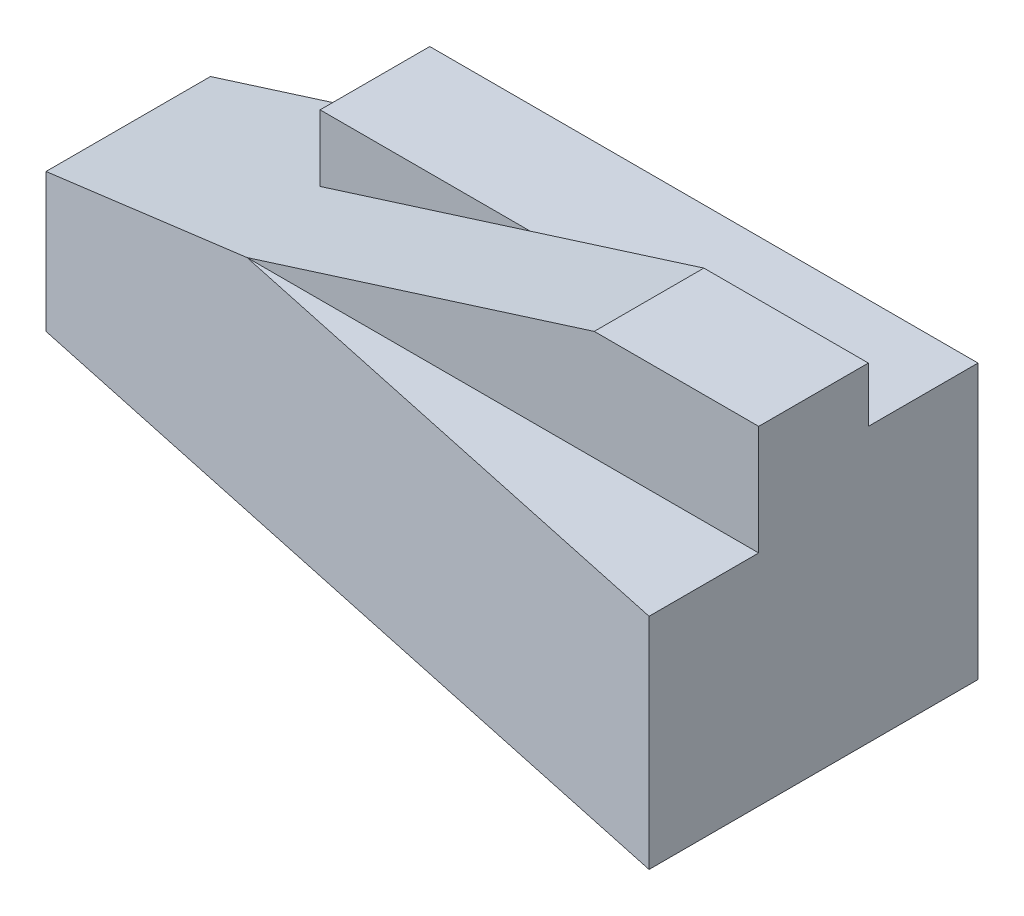
ISO-10303-21;
HEADER;
FILE_DESCRIPTION(('STEP AP214'),'2;1');
FILE_NAME('part.step','',(''),(''),'','','');
FILE_SCHEMA(('AUTOMOTIVE_DESIGN { 1 0 10303 214 1 1 1 1 }'));
ENDSEC;
DATA;
#1=APPLICATION_CONTEXT('core data for automotive mechanical design processes');
#2=APPLICATION_PROTOCOL_DEFINITION('international standard','automotive_design',2000,#1);
#3=PRODUCT_CONTEXT('',#1,'mechanical');
#4=PRODUCT('Part','Part','',(#3));
#5=PRODUCT_RELATED_PRODUCT_CATEGORY('part','',(#4));
#6=PRODUCT_DEFINITION_FORMATION('','',#4);
#7=PRODUCT_DEFINITION_CONTEXT('part definition',#1,'design');
#8=PRODUCT_DEFINITION('design','',#6,#7);
#9=PRODUCT_DEFINITION_SHAPE('','',#8);
#10=(LENGTH_UNIT() NAMED_UNIT(*) SI_UNIT(.MILLI.,.METRE.));
#11=(NAMED_UNIT(*) PLANE_ANGLE_UNIT() SI_UNIT($,.RADIAN.));
#12=(NAMED_UNIT(*) SI_UNIT($,.STERADIAN.) SOLID_ANGLE_UNIT());
#13=UNCERTAINTY_MEASURE_WITH_UNIT(LENGTH_MEASURE(1.E-05),#10,'distance_accuracy_value','');
#14=(GEOMETRIC_REPRESENTATION_CONTEXT(3) GLOBAL_UNCERTAINTY_ASSIGNED_CONTEXT((#13)) GLOBAL_UNIT_ASSIGNED_CONTEXT((#10,
#11,#12)) REPRESENTATION_CONTEXT('',''));
#15=CARTESIAN_POINT('',(0.,0.,0.));
#16=DIRECTION('',(0.,0.,1.));
#17=DIRECTION('',(1.,0.,0.));
#18=AXIS2_PLACEMENT_3D('',#15,#16,#17);
#19=CARTESIAN_POINT('',(70.,20.,0.));
#20=DIRECTION('',(0.,0.,1.));
#21=DIRECTION('',(1.,0.,0.));
#22=AXIS2_PLACEMENT_3D('',#19,#20,#21);
#23=PLANE('',#22);
#24=DIRECTION('',(-0.953582665134141,-0.3011313679371,0.));
#25=VECTOR('',#24,1.);
#26=CARTESIAN_POINT('',(20.3022670025189,19.0428211586901,0.));
#27=LINE('',#26,#25);
#28=CARTESIAN_POINT('',(20.,18.9473684210525,0.));
#29=VERTEX_POINT('',#28);
#30=CARTESIAN_POINT('',(0.,12.6315789473683,0.));
#31=VERTEX_POINT('',#30);
#32=EDGE_CURVE('E129',#29,#31,#27,.T.);
#33=ORIENTED_EDGE('',*,*,#32,.F.);
#34=DIRECTION('',(0.,-1.,0.));
#35=VECTOR('',#34,1.);
#36=CARTESIAN_POINT('',(20.,25.,0.));
#37=LINE('',#36,#35);
#38=CARTESIAN_POINT('',(20.,25.,0.));
#39=VERTEX_POINT('',#38);
#40=EDGE_CURVE('E63',#39,#29,#37,.T.);
#41=ORIENTED_EDGE('',*,*,#40,.F.);
#42=DIRECTION('',(-1.,0.,0.));
#43=VECTOR('',#42,1.);
#44=CARTESIAN_POINT('',(20.,25.,0.));
#45=LINE('',#44,#43);
#46=CARTESIAN_POINT('',(70.,25.,0.));
#47=VERTEX_POINT('',#46);
#48=EDGE_CURVE('E188',#47,#39,#45,.T.);
#49=ORIENTED_EDGE('',*,*,#48,.F.);
#50=DIRECTION('',(0.,-1.,0.));
#51=VECTOR('',#50,1.);
#52=CARTESIAN_POINT('',(70.,20.,0.));
#53=LINE('',#52,#51);
#54=CARTESIAN_POINT('',(70.,0.,0.));
#55=VERTEX_POINT('',#54);
#56=EDGE_CURVE('E154',#47,#55,#53,.T.);
#57=ORIENTED_EDGE('',*,*,#56,.T.);
#58=DIRECTION('',(-1.,0.,0.));
#59=VECTOR('',#58,1.);
#60=CARTESIAN_POINT('',(70.,0.,0.));
#61=LINE('',#60,#59);
#62=CARTESIAN_POINT('',(0.,0.,0.));
#63=VERTEX_POINT('',#62);
#64=EDGE_CURVE('E162',#55,#63,#61,.T.);
#65=ORIENTED_EDGE('',*,*,#64,.T.);
#66=DIRECTION('',(0.,-1.,0.));
#67=VECTOR('',#66,1.);
#68=CARTESIAN_POINT('',(0.,20.,0.));
#69=LINE('',#68,#67);
#70=EDGE_CURVE('E11',#31,#63,#69,.T.);
#71=ORIENTED_EDGE('',*,*,#70,.F.);
#72=EDGE_LOOP('',(#33,#41,#49,#57,#65,#71));
#73=FACE_BOUND('',#72,.T.);
#74=ADVANCED_FACE('F41',(#73),#23,.F.);
#75=CARTESIAN_POINT('',(0.,20.,0.));
#76=DIRECTION('',(1.,0.,0.));
#77=DIRECTION('',(0.,0.,-1.));
#78=AXIS2_PLACEMENT_3D('',#75,#76,#77);
#79=PLANE('',#78);
#80=DIRECTION('',(0.,0.,1.));
#81=VECTOR('',#80,1.);
#82=CARTESIAN_POINT('',(0.,12.6315789473683,0.));
#83=LINE('',#82,#81);
#84=CARTESIAN_POINT('',(0.,12.6315789473683,15.));
#85=VERTEX_POINT('',#84);
#86=EDGE_CURVE('E125',#31,#85,#83,.T.);
#87=ORIENTED_EDGE('',*,*,#86,.F.);
#88=ORIENTED_EDGE('',*,*,#70,.T.);
#89=DIRECTION('',(0.,0.,1.));
#90=VECTOR('',#89,1.);
#91=CARTESIAN_POINT('',(0.,0.,0.));
#92=LINE('',#91,#90);
#93=CARTESIAN_POINT('',(0.,0.,15.));
#94=VERTEX_POINT('',#93);
#95=EDGE_CURVE('E165',#63,#94,#92,.T.);
#96=ORIENTED_EDGE('',*,*,#95,.T.);
#97=DIRECTION('',(0.,-1.,0.));
#98=VECTOR('',#97,1.);
#99=CARTESIAN_POINT('',(0.,20.,15.));
#100=LINE('',#99,#98);
#101=EDGE_CURVE('E48',#85,#94,#100,.T.);
#102=ORIENTED_EDGE('',*,*,#101,.F.);
#103=EDGE_LOOP('',(#87,#88,#96,#102));
#104=FACE_BOUND('',#103,.T.);
#105=ADVANCED_FACE('F174',(#104),#79,.F.);
#106=CARTESIAN_POINT('',(0.,20.,15.));
#107=DIRECTION('',(0.209529088730873,0.,-0.97780241407741));
#108=DIRECTION('',(-0.97780241407741,0.,-0.209529088730873));
#109=AXIS2_PLACEMENT_3D('',#106,#107,#108);
#110=PLANE('',#109);
#111=DIRECTION('',(0.93427700121924,0.295034842490289,0.20020221454698));
#112=VECTOR('',#111,1.);
#113=CARTESIAN_POINT('',(2.03106302660965,13.2729672715608,15.4352277914164));
#114=LINE('',#113,#112);
#115=CARTESIAN_POINT('',(23.3333333333336,20.,20.));
#116=VERTEX_POINT('',#115);
#117=EDGE_CURVE('E117',#85,#116,#114,.T.);
#118=ORIENTED_EDGE('',*,*,#117,.F.);
#119=ORIENTED_EDGE('',*,*,#101,.T.);
#120=DIRECTION('',(0.97780241407741,0.,0.209529088730873));
#121=VECTOR('',#120,1.);
#122=CARTESIAN_POINT('',(0.,0.,15.));
#123=LINE('',#122,#121);
#124=CARTESIAN_POINT('',(70.,0.,30.));
#125=VERTEX_POINT('',#124);
#126=EDGE_CURVE('E156',#94,#125,#123,.T.);
#127=ORIENTED_EDGE('',*,*,#126,.T.);
#128=DIRECTION('',(0.,-1.,0.));
#129=VECTOR('',#128,1.);
#130=CARTESIAN_POINT('',(70.,20.,30.));
#131=LINE('',#130,#129);
#132=CARTESIAN_POINT('',(70.,20.,30.));
#133=VERTEX_POINT('',#132);
#134=EDGE_CURVE('E151',#133,#125,#131,.T.);
#135=ORIENTED_EDGE('',*,*,#134,.F.);
#136=DIRECTION('',(0.97780241407741,0.,0.209529088730873));
#137=VECTOR('',#136,1.);
#138=CARTESIAN_POINT('',(0.,20.,15.));
#139=LINE('',#138,#137);
#140=EDGE_CURVE('E135',#116,#133,#139,.T.);
#141=ORIENTED_EDGE('',*,*,#140,.F.);
#142=EDGE_LOOP('',(#118,#119,#127,#135,#141));
#143=FACE_BOUND('',#142,.T.);
#144=ADVANCED_FACE('F149',(#143),#110,.F.);
#145=CARTESIAN_POINT('',(70.,25.,10.));
#146=DIRECTION('',(0.,0.,-1.));
#147=DIRECTION('',(-1.,0.,0.));
#148=AXIS2_PLACEMENT_3D('',#145,#146,#147);
#149=PLANE('',#148);
#150=DIRECTION('',(0.,-1.,0.));
#151=VECTOR('',#150,1.);
#152=CARTESIAN_POINT('',(20.,25.,10.));
#153=LINE('',#152,#151);
#154=CARTESIAN_POINT('',(20.,25.,10.));
#155=VERTEX_POINT('',#154);
#156=CARTESIAN_POINT('',(20.,18.9473684210525,10.));
#157=VERTEX_POINT('',#156);
#158=EDGE_CURVE('E55',#155,#157,#153,.T.);
#159=ORIENTED_EDGE('',*,*,#158,.T.);
#160=DIRECTION('',(0.953582665134141,0.3011313679371,0.));
#161=VECTOR('',#160,1.);
#162=CARTESIAN_POINT('',(23.3333333333336,20.,10.));
#163=LINE('',#162,#161);
#164=CARTESIAN_POINT('',(39.1666666666668,25.,10.));
#165=VERTEX_POINT('',#164);
#166=EDGE_CURVE('E191',#157,#165,#163,.T.);
#167=ORIENTED_EDGE('',*,*,#166,.T.);
#168=DIRECTION('',(1.,0.,0.));
#169=VECTOR('',#168,1.);
#170=CARTESIAN_POINT('',(70.,25.,10.));
#171=LINE('',#170,#169);
#172=EDGE_CURVE('E197',#155,#165,#171,.T.);
#173=ORIENTED_EDGE('',*,*,#172,.F.);
#174=EDGE_LOOP('',(#159,#167,#173));
#175=FACE_BOUND('',#174,.T.);
#176=ADVANCED_FACE('F220',(#175),#149,.F.);
#177=CARTESIAN_POINT('',(0.,20.,0.));
#178=DIRECTION('',(0.,1.,0.));
#179=DIRECTION('',(0.,0.,1.));
#180=AXIS2_PLACEMENT_3D('',#177,#178,#179);
#181=PLANE('',#180);
#182=DIRECTION('',(1.,0.,0.));
#183=VECTOR('',#182,1.);
#184=CARTESIAN_POINT('',(70.,20.,20.));
#185=LINE('',#184,#183);
#186=CARTESIAN_POINT('',(70.,20.,20.));
#187=VERTEX_POINT('',#186);
#188=EDGE_CURVE('E133',#116,#187,#185,.T.);
#189=ORIENTED_EDGE('',*,*,#188,.F.);
#190=ORIENTED_EDGE('',*,*,#140,.T.);
#191=DIRECTION('',(0.,0.,-1.));
#192=VECTOR('',#191,1.);
#193=CARTESIAN_POINT('',(70.,20.,30.));
#194=LINE('',#193,#192);
#195=EDGE_CURVE('E138',#133,#187,#194,.T.);
#196=ORIENTED_EDGE('',*,*,#195,.T.);
#197=EDGE_LOOP('',(#189,#190,#196));
#198=FACE_BOUND('',#197,.T.);
#199=ADVANCED_FACE('F134',(#198),#181,.T.);
#200=CARTESIAN_POINT('',(55.,30.,10.));
#201=DIRECTION('',(0.,0.,1.));
#202=DIRECTION('',(1.,0.,0.));
#203=AXIS2_PLACEMENT_3D('',#200,#201,#202);
#204=PLANE('',#203);
#205=CARTESIAN_POINT('',(70.,25.,10.));
#206=VERTEX_POINT('',#205);
#207=EDGE_CURVE('E193',#165,#206,#171,.T.);
#208=ORIENTED_EDGE('',*,*,#207,.F.);
#209=CARTESIAN_POINT('',(55.,30.,9.99999999999999));
#210=VERTEX_POINT('',#209);
#211=EDGE_CURVE('E147',#165,#210,#163,.T.);
#212=ORIENTED_EDGE('',*,*,#211,.T.);
#213=DIRECTION('',(-1.,0.,0.));
#214=VECTOR('',#213,1.);
#215=CARTESIAN_POINT('',(55.,30.,10.));
#216=LINE('',#215,#214);
#217=CARTESIAN_POINT('',(70.,30.,10.));
#218=VERTEX_POINT('',#217);
#219=EDGE_CURVE('E206',#218,#210,#216,.T.);
#220=ORIENTED_EDGE('',*,*,#219,.F.);
#221=DIRECTION('',(0.,-1.,0.));
#222=VECTOR('',#221,1.);
#223=CARTESIAN_POINT('',(70.,30.,10.));
#224=LINE('',#223,#222);
#225=EDGE_CURVE('E159',#218,#206,#224,.T.);
#226=ORIENTED_EDGE('',*,*,#225,.T.);
#227=EDGE_LOOP('',(#208,#212,#220,#226));
#228=FACE_BOUND('',#227,.T.);
#229=ADVANCED_FACE('F217',(#228),#204,.F.);
#230=CARTESIAN_POINT('',(70.,20.,30.));
#231=DIRECTION('',(-1.,0.,0.));
#232=DIRECTION('',(0.,0.,1.));
#233=AXIS2_PLACEMENT_3D('',#230,#231,#232);
#234=PLANE('',#233);
#235=ORIENTED_EDGE('',*,*,#56,.F.);
#236=DIRECTION('',(0.,0.,-1.));
#237=VECTOR('',#236,1.);
#238=CARTESIAN_POINT('',(70.,25.,0.));
#239=LINE('',#238,#237);
#240=EDGE_CURVE('E200',#206,#47,#239,.T.);
#241=ORIENTED_EDGE('',*,*,#240,.F.);
#242=ORIENTED_EDGE('',*,*,#225,.F.);
#243=DIRECTION('',(0.,0.,-1.));
#244=VECTOR('',#243,1.);
#245=CARTESIAN_POINT('',(70.,30.,10.));
#246=LINE('',#245,#244);
#247=CARTESIAN_POINT('',(70.,30.,20.));
#248=VERTEX_POINT('',#247);
#249=EDGE_CURVE('E142',#248,#218,#246,.T.);
#250=ORIENTED_EDGE('',*,*,#249,.F.);
#251=DIRECTION('',(0.,-1.,0.));
#252=VECTOR('',#251,1.);
#253=CARTESIAN_POINT('',(70.,30.,20.));
#254=LINE('',#253,#252);
#255=EDGE_CURVE('E211',#248,#187,#254,.T.);
#256=ORIENTED_EDGE('',*,*,#255,.T.);
#257=ORIENTED_EDGE('',*,*,#195,.F.);
#258=ORIENTED_EDGE('',*,*,#134,.T.);
#259=DIRECTION('',(0.,0.,-1.));
#260=VECTOR('',#259,1.);
#261=CARTESIAN_POINT('',(70.,0.,30.));
#262=LINE('',#261,#260);
#263=EDGE_CURVE('E152',#125,#55,#262,.T.);
#264=ORIENTED_EDGE('',*,*,#263,.T.);
#265=EDGE_LOOP('',(#235,#241,#242,#250,#256,#257,#258,#264));
#266=FACE_BOUND('',#265,.T.);
#267=ADVANCED_FACE('F181',(#266),#234,.F.);
#268=CARTESIAN_POINT('',(0.,0.,0.));
#269=DIRECTION('',(0.,1.,0.));
#270=DIRECTION('',(0.,0.,1.));
#271=AXIS2_PLACEMENT_3D('',#268,#269,#270);
#272=PLANE('',#271);
#273=ORIENTED_EDGE('',*,*,#64,.F.);
#274=ORIENTED_EDGE('',*,*,#263,.F.);
#275=ORIENTED_EDGE('',*,*,#126,.F.);
#276=ORIENTED_EDGE('',*,*,#95,.F.);
#277=EDGE_LOOP('',(#273,#274,#275,#276));
#278=FACE_BOUND('',#277,.T.);
#279=ADVANCED_FACE('F179',(#278),#272,.F.);
#280=CARTESIAN_POINT('',(70.,30.,20.));
#281=DIRECTION('',(0.,0.,-1.));
#282=DIRECTION('',(-1.,0.,0.));
#283=AXIS2_PLACEMENT_3D('',#280,#281,#282);
#284=PLANE('',#283);
#285=ORIENTED_EDGE('',*,*,#188,.T.);
#286=ORIENTED_EDGE('',*,*,#255,.F.);
#287=DIRECTION('',(1.,0.,0.));
#288=VECTOR('',#287,1.);
#289=CARTESIAN_POINT('',(70.,30.,20.));
#290=LINE('',#289,#288);
#291=CARTESIAN_POINT('',(55.,30.,20.));
#292=VERTEX_POINT('',#291);
#293=EDGE_CURVE('E146',#292,#248,#290,.T.);
#294=ORIENTED_EDGE('',*,*,#293,.F.);
#295=DIRECTION('',(0.953582665134141,0.3011313679371,0.));
#296=VECTOR('',#295,1.);
#297=CARTESIAN_POINT('',(23.3333333333336,20.,20.));
#298=LINE('',#297,#296);
#299=EDGE_CURVE('E122',#116,#292,#298,.T.);
#300=ORIENTED_EDGE('',*,*,#299,.F.);
#301=EDGE_LOOP('',(#285,#286,#294,#300));
#302=FACE_BOUND('',#301,.T.);
#303=ADVANCED_FACE('F145',(#302),#284,.F.);
#304=CARTESIAN_POINT('',(0.,30.,0.));
#305=DIRECTION('',(0.,-1.,0.));
#306=DIRECTION('',(0.,0.,-1.));
#307=AXIS2_PLACEMENT_3D('',#304,#305,#306);
#308=PLANE('',#307);
#309=ORIENTED_EDGE('',*,*,#249,.T.);
#310=ORIENTED_EDGE('',*,*,#219,.T.);
#311=DIRECTION('',(0.,0.,1.));
#312=VECTOR('',#311,1.);
#313=CARTESIAN_POINT('',(55.,30.,20.));
#314=LINE('',#313,#312);
#315=EDGE_CURVE('E209',#210,#292,#314,.T.);
#316=ORIENTED_EDGE('',*,*,#315,.T.);
#317=ORIENTED_EDGE('',*,*,#293,.T.);
#318=EDGE_LOOP('',(#309,#310,#316,#317));
#319=FACE_BOUND('',#318,.T.);
#320=ADVANCED_FACE('F227',(#319),#308,.F.);
#321=CARTESIAN_POINT('',(20.,25.,10.));
#322=DIRECTION('',(1.,0.,0.));
#323=DIRECTION('',(0.,0.,-1.));
#324=AXIS2_PLACEMENT_3D('',#321,#322,#323);
#325=PLANE('',#324);
#326=ORIENTED_EDGE('',*,*,#40,.T.);
#327=DIRECTION('',(0.,0.,1.));
#328=VECTOR('',#327,1.);
#329=CARTESIAN_POINT('',(20.,18.9473684210525,-1.09572697424552));
#330=LINE('',#329,#328);
#331=EDGE_CURVE('E221',#29,#157,#330,.T.);
#332=ORIENTED_EDGE('',*,*,#331,.T.);
#333=ORIENTED_EDGE('',*,*,#158,.F.);
#334=DIRECTION('',(0.,0.,1.));
#335=VECTOR('',#334,1.);
#336=CARTESIAN_POINT('',(20.,25.,10.));
#337=LINE('',#336,#335);
#338=EDGE_CURVE('E190',#39,#155,#337,.T.);
#339=ORIENTED_EDGE('',*,*,#338,.F.);
#340=EDGE_LOOP('',(#326,#332,#333,#339));
#341=FACE_BOUND('',#340,.T.);
#342=ADVANCED_FACE('F222',(#341),#325,.F.);
#343=CARTESIAN_POINT('',(0.,25.,0.));
#344=DIRECTION('',(0.,-1.,0.));
#345=DIRECTION('',(0.,0.,-1.));
#346=AXIS2_PLACEMENT_3D('',#343,#344,#345);
#347=PLANE('',#346);
#348=ORIENTED_EDGE('',*,*,#48,.T.);
#349=ORIENTED_EDGE('',*,*,#338,.T.);
#350=ORIENTED_EDGE('',*,*,#172,.T.);
#351=ORIENTED_EDGE('',*,*,#207,.T.);
#352=ORIENTED_EDGE('',*,*,#240,.T.);
#353=EDGE_LOOP('',(#348,#349,#350,#351,#352));
#354=FACE_BOUND('',#353,.T.);
#355=ADVANCED_FACE('F219',(#354),#347,.F.);
#356=CARTESIAN_POINT('',(23.3333333333336,20.,-23.2080980752852));
#357=DIRECTION('',(0.3011313679371,-0.953582665134141,0.));
#358=DIRECTION('',(0.953582665134141,0.3011313679371,0.));
#359=AXIS2_PLACEMENT_3D('',#356,#357,#358);
#360=PLANE('',#359);
#361=ORIENTED_EDGE('',*,*,#166,.F.);
#362=ORIENTED_EDGE('',*,*,#331,.F.);
#363=ORIENTED_EDGE('',*,*,#32,.T.);
#364=ORIENTED_EDGE('',*,*,#86,.T.);
#365=ORIENTED_EDGE('',*,*,#117,.T.);
#366=ORIENTED_EDGE('',*,*,#299,.T.);
#367=ORIENTED_EDGE('',*,*,#315,.F.);
#368=ORIENTED_EDGE('',*,*,#211,.F.);
#369=EDGE_LOOP('',(#361,#362,#363,#364,#365,#366,#367,#368));
#370=FACE_BOUND('',#369,.T.);
#371=ADVANCED_FACE('F119',(#370),#360,.F.);
#372=CLOSED_SHELL('',(#74,#105,#144,#176,#199,#229,#267,#279,#303,#320,#342,#355,#371));
#373=MANIFOLD_SOLID_BREP('B2',#372);
#374=ADVANCED_BREP_SHAPE_REPRESENTATION('',(#18,#373),#14);
#375=SHAPE_DEFINITION_REPRESENTATION(#9,#374);
ENDSEC;
END-ISO-10303-21;
